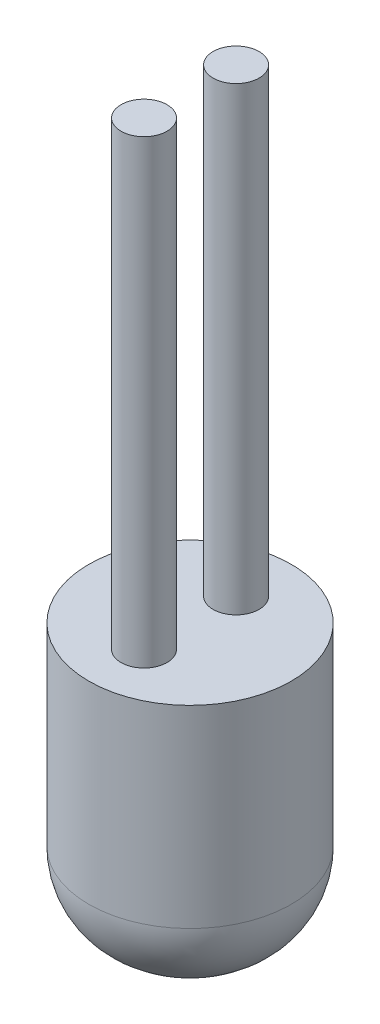
ISO-10303-21;
HEADER;
FILE_DESCRIPTION(('STEP AP214'),'2;1');
FILE_NAME('part.step','',(''),(''),'','','');
FILE_SCHEMA(('AUTOMOTIVE_DESIGN { 1 0 10303 214 1 1 1 1 }'));
ENDSEC;
DATA;
#1=APPLICATION_CONTEXT('core data for automotive mechanical design processes');
#2=APPLICATION_PROTOCOL_DEFINITION('international standard','automotive_design',2000,#1);
#3=PRODUCT_CONTEXT('',#1,'mechanical');
#4=PRODUCT('Part','Part','',(#3));
#5=PRODUCT_RELATED_PRODUCT_CATEGORY('part','',(#4));
#6=PRODUCT_DEFINITION_FORMATION('','',#4);
#7=PRODUCT_DEFINITION_CONTEXT('part definition',#1,'design');
#8=PRODUCT_DEFINITION('design','',#6,#7);
#9=PRODUCT_DEFINITION_SHAPE('','',#8);
#10=(LENGTH_UNIT() NAMED_UNIT(*) SI_UNIT(.MILLI.,.METRE.));
#11=(NAMED_UNIT(*) PLANE_ANGLE_UNIT() SI_UNIT($,.RADIAN.));
#12=(NAMED_UNIT(*) SI_UNIT($,.STERADIAN.) SOLID_ANGLE_UNIT());
#13=UNCERTAINTY_MEASURE_WITH_UNIT(LENGTH_MEASURE(1.E-05),#10,'distance_accuracy_value','');
#14=(GEOMETRIC_REPRESENTATION_CONTEXT(3) GLOBAL_UNCERTAINTY_ASSIGNED_CONTEXT((#13)) GLOBAL_UNIT_ASSIGNED_CONTEXT((#10,
#11,#12)) REPRESENTATION_CONTEXT('',''));
#15=CARTESIAN_POINT('',(0.,0.,0.));
#16=DIRECTION('',(0.,0.,1.));
#17=DIRECTION('',(1.,0.,0.));
#18=AXIS2_PLACEMENT_3D('',#15,#16,#17);
#19=CARTESIAN_POINT('',(0.,3.,0.));
#20=DIRECTION('',(0.,1.,0.));
#21=DIRECTION('',(0.,0.,1.));
#22=AXIS2_PLACEMENT_3D('',#19,#20,#21);
#23=PLANE('',#22);
#24=CARTESIAN_POINT('',(0.,3.,-0.5));
#25=DIRECTION('',(0.,1.,0.));
#26=DIRECTION('',(0.,0.,1.));
#27=AXIS2_PLACEMENT_3D('',#24,#25,#26);
#28=CIRCLE('',#27,0.25);
#29=CARTESIAN_POINT('',(0.,3.,-0.25));
#30=VERTEX_POINT('',#29);
#31=EDGE_CURVE('E50',#30,#30,#28,.T.);
#32=ORIENTED_EDGE('',*,*,#31,.F.);
#33=EDGE_LOOP('',(#32));
#34=FACE_BOUND('',#33,.T.);
#35=CARTESIAN_POINT('',(0.,3.,0.));
#36=DIRECTION('',(0.,1.,0.));
#37=DIRECTION('',(0.,0.,1.));
#38=AXIS2_PLACEMENT_3D('',#35,#36,#37);
#39=CIRCLE('',#38,1.1);
#40=CARTESIAN_POINT('',(0.,3.,1.1));
#41=VERTEX_POINT('',#40);
#42=EDGE_CURVE('E41',#41,#41,#39,.T.);
#43=ORIENTED_EDGE('',*,*,#42,.T.);
#44=EDGE_LOOP('',(#43));
#45=FACE_BOUND('',#44,.T.);
#46=CARTESIAN_POINT('',(0.,3.,0.5));
#47=DIRECTION('',(0.,1.,0.));
#48=DIRECTION('',(0.,0.,-1.));
#49=AXIS2_PLACEMENT_3D('',#46,#47,#48);
#50=CIRCLE('',#49,0.25);
#51=CARTESIAN_POINT('',(0.,3.,0.25));
#52=VERTEX_POINT('',#51);
#53=EDGE_CURVE('E56',#52,#52,#50,.T.);
#54=ORIENTED_EDGE('',*,*,#53,.F.);
#55=EDGE_LOOP('',(#54));
#56=FACE_BOUND('',#55,.T.);
#57=ADVANCED_FACE('F30',(#34,#45,#56),#23,.T.);
#58=CARTESIAN_POINT('',(0.,3.,0.));
#59=DIRECTION('',(0.,-1.,0.));
#60=DIRECTION('',(0.,0.,-1.));
#61=AXIS2_PLACEMENT_3D('',#58,#59,#60);
#62=CYLINDRICAL_SURFACE('',#61,1.1);
#63=CARTESIAN_POINT('',(0.,0.9,0.));
#64=DIRECTION('',(0.,1.,0.));
#65=DIRECTION('',(0.,0.,1.));
#66=AXIS2_PLACEMENT_3D('',#63,#64,#65);
#67=CIRCLE('',#66,1.1);
#68=CARTESIAN_POINT('',(0.,0.9,1.1));
#69=VERTEX_POINT('',#68);
#70=EDGE_CURVE('E37',#69,#69,#67,.T.);
#71=ORIENTED_EDGE('',*,*,#70,.T.);
#72=EDGE_LOOP('',(#71));
#73=FACE_BOUND('',#72,.T.);
#74=ORIENTED_EDGE('',*,*,#42,.F.);
#75=EDGE_LOOP('',(#74));
#76=FACE_BOUND('',#75,.T.);
#77=ADVANCED_FACE('F32',(#73,#76),#62,.T.);
#78=CARTESIAN_POINT('',(0.,0.,0.));
#79=DIRECTION('',(0.,1.,0.));
#80=DIRECTION('',(0.,0.,1.));
#81=AXIS2_PLACEMENT_3D('',#78,#79,#80);
#82=PLANE('',#81);
#83=CARTESIAN_POINT('',(0.,0.,0.));
#84=DIRECTION('',(0.,1.,0.));
#85=DIRECTION('',(0.,0.,1.));
#86=AXIS2_PLACEMENT_3D('',#83,#84,#85);
#87=CIRCLE('',#86,0.2);
#88=CARTESIAN_POINT('',(0.,0.,0.2));
#89=VERTEX_POINT('',#88);
#90=EDGE_CURVE('E10',#89,#89,#87,.F.);
#91=ORIENTED_EDGE('',*,*,#90,.T.);
#92=EDGE_LOOP('',(#91));
#93=FACE_BOUND('',#92,.T.);
#94=ADVANCED_FACE('F67',(#93),#82,.F.);
#95=CARTESIAN_POINT('',(0.,0.9,0.));
#96=DIRECTION('',(0.,1.,0.));
#97=DIRECTION('',(0.,0.,1.));
#98=AXIS2_PLACEMENT_3D('',#95,#96,#97);
#99=DEGENERATE_TOROIDAL_SURFACE('',#98,0.2,0.9,.T.);
#100=ORIENTED_EDGE('',*,*,#90,.F.);
#101=EDGE_LOOP('',(#100));
#102=FACE_BOUND('',#101,.T.);
#103=ORIENTED_EDGE('',*,*,#70,.F.);
#104=EDGE_LOOP('',(#103));
#105=FACE_BOUND('',#104,.T.);
#106=ADVANCED_FACE('F73',(#102,#105),#99,.T.);
#107=CARTESIAN_POINT('',(0.,8.,-0.5));
#108=DIRECTION('',(0.,-1.,0.));
#109=DIRECTION('',(0.,0.,-1.));
#110=AXIS2_PLACEMENT_3D('',#107,#108,#109);
#111=CYLINDRICAL_SURFACE('',#110,0.25);
#112=CARTESIAN_POINT('',(0.,8.,-0.5));
#113=DIRECTION('',(0.,1.,0.));
#114=DIRECTION('',(0.,0.,1.));
#115=AXIS2_PLACEMENT_3D('',#112,#113,#114);
#116=CIRCLE('',#115,0.25);
#117=CARTESIAN_POINT('',(0.,8.,-0.25));
#118=VERTEX_POINT('',#117);
#119=EDGE_CURVE('E45',#118,#118,#116,.T.);
#120=ORIENTED_EDGE('',*,*,#119,.F.);
#121=EDGE_LOOP('',(#120));
#122=FACE_BOUND('',#121,.T.);
#123=ORIENTED_EDGE('',*,*,#31,.T.);
#124=EDGE_LOOP('',(#123));
#125=FACE_BOUND('',#124,.T.);
#126=ADVANCED_FACE('F76',(#122,#125),#111,.T.);
#127=CARTESIAN_POINT('',(0.,8.,-0.5));
#128=DIRECTION('',(0.,1.,0.));
#129=DIRECTION('',(0.,0.,1.));
#130=AXIS2_PLACEMENT_3D('',#127,#128,#129);
#131=PLANE('',#130);
#132=ORIENTED_EDGE('',*,*,#119,.T.);
#133=EDGE_LOOP('',(#132));
#134=FACE_BOUND('',#133,.T.);
#135=ADVANCED_FACE('F80',(#134),#131,.T.);
#136=CARTESIAN_POINT('',(0.,8.,0.5));
#137=DIRECTION('',(0.,-1.,0.));
#138=DIRECTION('',(0.,0.,-1.));
#139=AXIS2_PLACEMENT_3D('',#136,#137,#138);
#140=CYLINDRICAL_SURFACE('',#139,0.25);
#141=CARTESIAN_POINT('',(0.,8.,0.5));
#142=DIRECTION('',(0.,1.,0.));
#143=DIRECTION('',(0.,0.,-1.));
#144=AXIS2_PLACEMENT_3D('',#141,#142,#143);
#145=CIRCLE('',#144,0.25);
#146=CARTESIAN_POINT('',(0.,8.,0.25));
#147=VERTEX_POINT('',#146);
#148=EDGE_CURVE('E53',#147,#147,#145,.T.);
#149=ORIENTED_EDGE('',*,*,#148,.F.);
#150=EDGE_LOOP('',(#149));
#151=FACE_BOUND('',#150,.T.);
#152=ORIENTED_EDGE('',*,*,#53,.T.);
#153=EDGE_LOOP('',(#152));
#154=FACE_BOUND('',#153,.T.);
#155=ADVANCED_FACE('F60',(#151,#154),#140,.T.);
#156=CARTESIAN_POINT('',(0.,8.,0.5));
#157=DIRECTION('',(0.,-1.,0.));
#158=DIRECTION('',(0.,0.,-1.));
#159=AXIS2_PLACEMENT_3D('',#156,#157,#158);
#160=PLANE('',#159);
#161=ORIENTED_EDGE('',*,*,#148,.T.);
#162=EDGE_LOOP('',(#161));
#163=FACE_BOUND('',#162,.T.);
#164=ADVANCED_FACE('F87',(#163),#160,.F.);
#165=CLOSED_SHELL('',(#57,#77,#94,#106,#126,#135,#155,#164));
#166=MANIFOLD_SOLID_BREP('B2',#165);
#167=ADVANCED_BREP_SHAPE_REPRESENTATION('',(#18,#166),#14);
#168=SHAPE_DEFINITION_REPRESENTATION(#9,#167);
ENDSEC;
END-ISO-10303-21;
